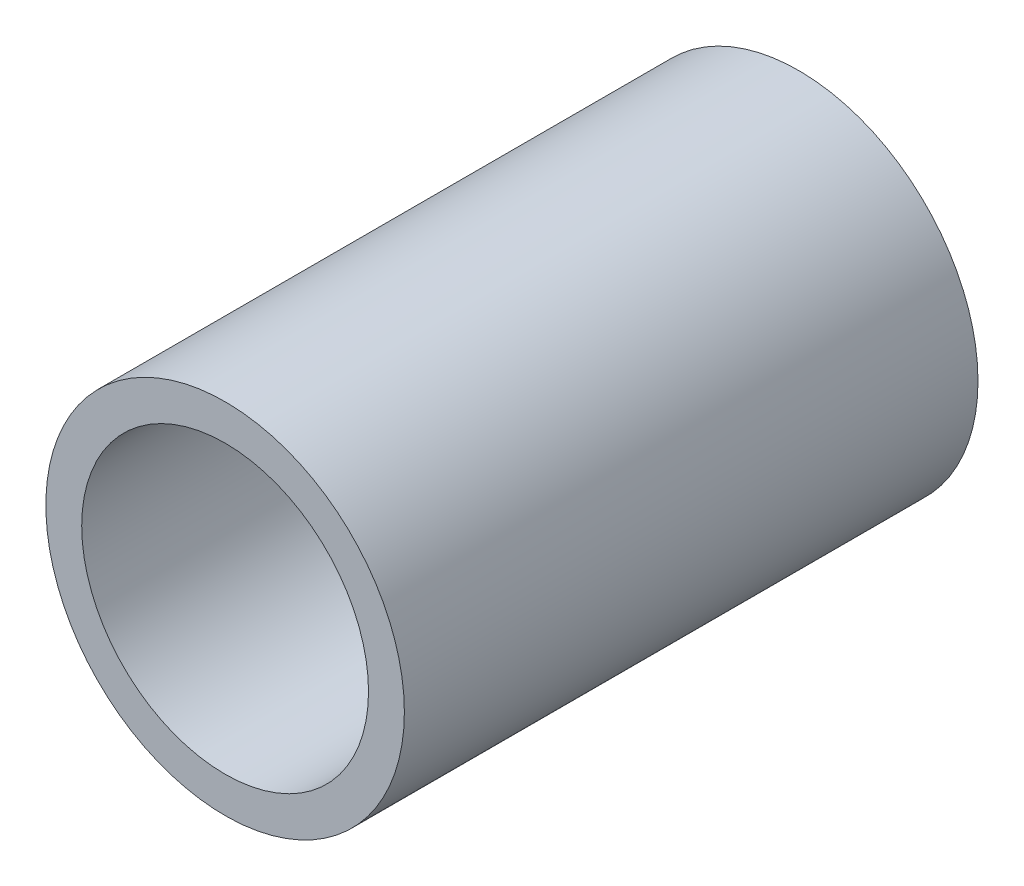
ISO-10303-21;
HEADER;
FILE_DESCRIPTION(('STEP AP214'),'2;1');
FILE_NAME('part.step','',(''),(''),'','','');
FILE_SCHEMA(('AUTOMOTIVE_DESIGN { 1 0 10303 214 1 1 1 1 }'));
ENDSEC;
DATA;
#1=APPLICATION_CONTEXT('core data for automotive mechanical design processes');
#2=APPLICATION_PROTOCOL_DEFINITION('international standard','automotive_design',2000,#1);
#3=PRODUCT_CONTEXT('',#1,'mechanical');
#4=PRODUCT('Part','Part','',(#3));
#5=PRODUCT_RELATED_PRODUCT_CATEGORY('part','',(#4));
#6=PRODUCT_DEFINITION_FORMATION('','',#4);
#7=PRODUCT_DEFINITION_CONTEXT('part definition',#1,'design');
#8=PRODUCT_DEFINITION('design','',#6,#7);
#9=PRODUCT_DEFINITION_SHAPE('','',#8);
#10=(LENGTH_UNIT() NAMED_UNIT(*) SI_UNIT(.MILLI.,.METRE.));
#11=(NAMED_UNIT(*) PLANE_ANGLE_UNIT() SI_UNIT($,.RADIAN.));
#12=(NAMED_UNIT(*) SI_UNIT($,.STERADIAN.) SOLID_ANGLE_UNIT());
#13=UNCERTAINTY_MEASURE_WITH_UNIT(LENGTH_MEASURE(1.E-05),#10,'distance_accuracy_value','');
#14=(GEOMETRIC_REPRESENTATION_CONTEXT(3) GLOBAL_UNCERTAINTY_ASSIGNED_CONTEXT((#13)) GLOBAL_UNIT_ASSIGNED_CONTEXT((#10,
#11,#12)) REPRESENTATION_CONTEXT('',''));
#15=CARTESIAN_POINT('',(0.,0.,0.));
#16=DIRECTION('',(0.,0.,1.));
#17=DIRECTION('',(1.,0.,0.));
#18=AXIS2_PLACEMENT_3D('',#15,#16,#17);
#19=CARTESIAN_POINT('',(0.,0.,24.));
#20=DIRECTION('',(0.,0.,1.));
#21=DIRECTION('',(1.,0.,0.));
#22=AXIS2_PLACEMENT_3D('',#19,#20,#21);
#23=PLANE('',#22);
#24=CARTESIAN_POINT('',(0.,0.,24.));
#25=DIRECTION('',(0.,0.,1.));
#26=DIRECTION('',(1.,0.,0.));
#27=AXIS2_PLACEMENT_3D('',#24,#25,#26);
#28=CIRCLE('',#27,7.5);
#29=CARTESIAN_POINT('',(7.5,0.,24.));
#30=VERTEX_POINT('',#29);
#31=EDGE_CURVE('E10',#30,#30,#28,.T.);
#32=ORIENTED_EDGE('',*,*,#31,.T.);
#33=EDGE_LOOP('',(#32));
#34=FACE_BOUND('',#33,.T.);
#35=CARTESIAN_POINT('',(0.,0.,24.));
#36=DIRECTION('',(0.,0.,1.));
#37=DIRECTION('',(1.,0.,0.));
#38=AXIS2_PLACEMENT_3D('',#35,#36,#37);
#39=CIRCLE('',#38,6.);
#40=CARTESIAN_POINT('',(6.,0.,24.));
#41=VERTEX_POINT('',#40);
#42=EDGE_CURVE('E54',#41,#41,#39,.T.);
#43=ORIENTED_EDGE('',*,*,#42,.F.);
#44=EDGE_LOOP('',(#43));
#45=FACE_BOUND('',#44,.T.);
#46=ADVANCED_FACE('F41',(#34,#45),#23,.T.);
#47=CARTESIAN_POINT('',(0.,0.,0.));
#48=DIRECTION('',(0.,0.,1.));
#49=DIRECTION('',(1.,0.,0.));
#50=AXIS2_PLACEMENT_3D('',#47,#48,#49);
#51=PLANE('',#50);
#52=CARTESIAN_POINT('',(0.,0.,0.));
#53=DIRECTION('',(0.,0.,1.));
#54=DIRECTION('',(1.,0.,0.));
#55=AXIS2_PLACEMENT_3D('',#52,#53,#54);
#56=CIRCLE('',#55,7.5);
#57=CARTESIAN_POINT('',(7.5,0.,0.));
#58=VERTEX_POINT('',#57);
#59=EDGE_CURVE('E45',#58,#58,#56,.T.);
#60=ORIENTED_EDGE('',*,*,#59,.F.);
#61=EDGE_LOOP('',(#60));
#62=FACE_BOUND('',#61,.T.);
#63=CARTESIAN_POINT('',(0.,0.,0.));
#64=DIRECTION('',(0.,0.,1.));
#65=DIRECTION('',(1.,0.,0.));
#66=AXIS2_PLACEMENT_3D('',#63,#64,#65);
#67=CIRCLE('',#66,6.);
#68=CARTESIAN_POINT('',(6.,0.,0.));
#69=VERTEX_POINT('',#68);
#70=EDGE_CURVE('E56',#69,#69,#67,.T.);
#71=ORIENTED_EDGE('',*,*,#70,.T.);
#72=EDGE_LOOP('',(#71));
#73=FACE_BOUND('',#72,.T.);
#74=ADVANCED_FACE('F68',(#62,#73),#51,.F.);
#75=CARTESIAN_POINT('',(0.,0.,24.));
#76=DIRECTION('',(0.,0.,-1.));
#77=DIRECTION('',(-1.,0.,0.));
#78=AXIS2_PLACEMENT_3D('',#75,#76,#77);
#79=CYLINDRICAL_SURFACE('',#78,7.5);
#80=ORIENTED_EDGE('',*,*,#31,.F.);
#81=EDGE_LOOP('',(#80));
#82=FACE_BOUND('',#81,.T.);
#83=ORIENTED_EDGE('',*,*,#59,.T.);
#84=EDGE_LOOP('',(#83));
#85=FACE_BOUND('',#84,.T.);
#86=ADVANCED_FACE('F43',(#82,#85),#79,.T.);
#87=CARTESIAN_POINT('',(0.,0.,24.));
#88=DIRECTION('',(0.,0.,-1.));
#89=DIRECTION('',(-1.,0.,0.));
#90=AXIS2_PLACEMENT_3D('',#87,#88,#89);
#91=CYLINDRICAL_SURFACE('',#90,6.);
#92=ORIENTED_EDGE('',*,*,#42,.T.);
#93=EDGE_LOOP('',(#92));
#94=FACE_BOUND('',#93,.T.);
#95=ORIENTED_EDGE('',*,*,#70,.F.);
#96=EDGE_LOOP('',(#95));
#97=FACE_BOUND('',#96,.T.);
#98=ADVANCED_FACE('F64',(#94,#97),#91,.F.);
#99=CLOSED_SHELL('',(#46,#74,#86,#98));
#100=MANIFOLD_SOLID_BREP('B2',#99);
#101=ADVANCED_BREP_SHAPE_REPRESENTATION('',(#18,#100),#14);
#102=SHAPE_DEFINITION_REPRESENTATION(#9,#101);
ENDSEC;
END-ISO-10303-21;
